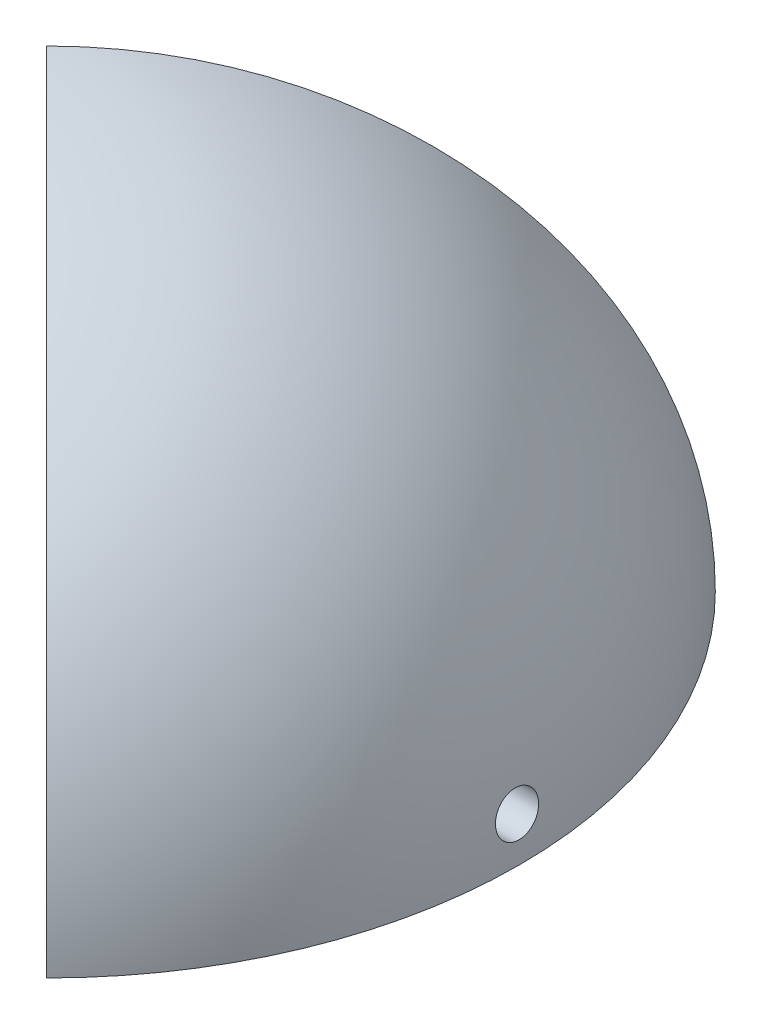
ISO-10303-21;
HEADER;
FILE_DESCRIPTION(('STEP AP214'),'2;1');
FILE_NAME('part.step','',(''),(''),'','','');
FILE_SCHEMA(('AUTOMOTIVE_DESIGN { 1 0 10303 214 1 1 1 1 }'));
ENDSEC;
DATA;
#1=APPLICATION_CONTEXT('core data for automotive mechanical design processes');
#2=APPLICATION_PROTOCOL_DEFINITION('international standard','automotive_design',2000,#1);
#3=PRODUCT_CONTEXT('',#1,'mechanical');
#4=PRODUCT('Part','Part','',(#3));
#5=PRODUCT_RELATED_PRODUCT_CATEGORY('part','',(#4));
#6=PRODUCT_DEFINITION_FORMATION('','',#4);
#7=PRODUCT_DEFINITION_CONTEXT('part definition',#1,'design');
#8=PRODUCT_DEFINITION('design','',#6,#7);
#9=PRODUCT_DEFINITION_SHAPE('','',#8);
#10=(LENGTH_UNIT() NAMED_UNIT(*) SI_UNIT(.MILLI.,.METRE.));
#11=(NAMED_UNIT(*) PLANE_ANGLE_UNIT() SI_UNIT($,.RADIAN.));
#12=(NAMED_UNIT(*) SI_UNIT($,.STERADIAN.) SOLID_ANGLE_UNIT());
#13=UNCERTAINTY_MEASURE_WITH_UNIT(LENGTH_MEASURE(1.E-05),#10,'distance_accuracy_value','');
#14=(GEOMETRIC_REPRESENTATION_CONTEXT(3) GLOBAL_UNCERTAINTY_ASSIGNED_CONTEXT((#13)) GLOBAL_UNIT_ASSIGNED_CONTEXT((#10,
#11,#12)) REPRESENTATION_CONTEXT('',''));
#15=CARTESIAN_POINT('',(0.,0.,0.));
#16=DIRECTION('',(0.,0.,1.));
#17=DIRECTION('',(1.,0.,0.));
#18=AXIS2_PLACEMENT_3D('',#15,#16,#17);
#19=CARTESIAN_POINT('',(0.,0.,0.));
#20=DIRECTION('',(0.,1.,0.));
#21=DIRECTION('',(0.707106781186546,0.,0.707106781186549));
#22=AXIS2_PLACEMENT_3D('',#19,#20,#21);
#23=SPHERICAL_SURFACE('',#22,105.);
#24=CARTESIAN_POINT('',(0.,0.,-10.));
#25=DIRECTION('',(0.,0.,1.));
#26=DIRECTION('',(1.,0.,0.));
#27=AXIS2_PLACEMENT_3D('',#24,#25,#26);
#28=CIRCLE('',#27,104.522724801834);
#29=CARTESIAN_POINT('',(102.591422643416,20.,-10.));
#30=VERTEX_POINT('',#29);
#31=CARTESIAN_POINT('',(104.522724801834,0.,-10.));
#32=VERTEX_POINT('',#31);
#33=EDGE_CURVE('E145',#30,#32,#28,.F.);
#34=ORIENTED_EDGE('',*,*,#33,.F.);
#35=CARTESIAN_POINT('',(0.,20.0000000000001,0.));
#36=DIRECTION('',(0.,1.,0.));
#37=DIRECTION('',(-1.,0.,0.));
#38=AXIS2_PLACEMENT_3D('',#35,#36,#37);
#39=CIRCLE('',#38,103.077640640441);
#40=CARTESIAN_POINT('',(102.591422643416,20.,10.));
#41=VERTEX_POINT('',#40);
#42=EDGE_CURVE('E11',#30,#41,#39,.F.);
#43=ORIENTED_EDGE('',*,*,#42,.T.);
#44=CARTESIAN_POINT('',(0.,0.,10.));
#45=DIRECTION('',(0.,0.,1.));
#46=DIRECTION('',(1.,0.,0.));
#47=AXIS2_PLACEMENT_3D('',#44,#45,#46);
#48=CIRCLE('',#47,104.522724801834);
#49=CARTESIAN_POINT('',(104.522724801834,0.,9.99999999999999));
#50=VERTEX_POINT('',#49);
#51=EDGE_CURVE('E109',#41,#50,#48,.F.);
#52=ORIENTED_EDGE('',*,*,#51,.T.);
#53=CARTESIAN_POINT('',(0.,0.,0.));
#54=DIRECTION('',(0.,1.,0.));
#55=DIRECTION('',(-1.,0.,0.));
#56=AXIS2_PLACEMENT_3D('',#53,#54,#55);
#57=CIRCLE('',#56,105.);
#58=CARTESIAN_POINT('',(74.2462120245874,0.,74.2462120245876));
#59=VERTEX_POINT('',#58);
#60=EDGE_CURVE('E53',#59,#50,#57,.T.);
#61=ORIENTED_EDGE('',*,*,#60,.F.);
#62=CARTESIAN_POINT('',(0.,0.,0.));
#63=DIRECTION('',(0.707106781186549,0.,-0.707106781186546));
#64=DIRECTION('',(0.707106781186546,0.,0.707106781186549));
#65=AXIS2_PLACEMENT_3D('',#62,#63,#64);
#66=CIRCLE('',#65,105.);
#67=CARTESIAN_POINT('',(0.,105.,0.));
#68=VERTEX_POINT('',#67);
#69=EDGE_CURVE('E167',#68,#59,#66,.T.);
#70=ORIENTED_EDGE('',*,*,#69,.F.);
#71=CARTESIAN_POINT('',(0.,0.,0.));
#72=DIRECTION('',(-0.707106781186549,0.,-0.707106781186546));
#73=DIRECTION('',(0.707106781186546,0.,-0.707106781186549));
#74=AXIS2_PLACEMENT_3D('',#71,#72,#73);
#75=CIRCLE('',#74,105.);
#76=CARTESIAN_POINT('',(74.2462120245874,0.,-74.2462120245876));
#77=VERTEX_POINT('',#76);
#78=EDGE_CURVE('E152',#68,#77,#75,.T.);
#79=ORIENTED_EDGE('',*,*,#78,.T.);
#80=EDGE_CURVE('E176',#32,#77,#57,.T.);
#81=ORIENTED_EDGE('',*,*,#80,.F.);
#82=EDGE_LOOP('',(#34,#43,#52,#61,#70,#79,#81));
#83=FACE_BOUND('',#82,.T.);
#84=ADVANCED_FACE('F45',(#83),#23,.F.);
#85=CARTESIAN_POINT('',(0.,0.,0.));
#86=DIRECTION('',(0.,1.,0.));
#87=DIRECTION('',(0.707106781186546,0.,0.707106781186549));
#88=AXIS2_PLACEMENT_3D('',#85,#86,#87);
#89=SPHERICAL_SURFACE('',#88,110.);
#90=CARTESIAN_POINT('',(109.746023045079,6.54052128911879,-3.60998712591214));
#91=CARTESIAN_POINT('',(109.755239097218,6.43937878547632,-3.51306300951663));
#92=CARTESIAN_POINT('',(109.764082984741,6.3423078868576,-3.41188039825184));
#93=CARTESIAN_POINT('',(109.780969115739,6.15694456811909,-3.20165014635052));
#94=CARTESIAN_POINT('',(109.789011156165,6.06865437151453,-3.09260052557191));
#95=CARTESIAN_POINT('',(109.804239398578,5.90145341711939,-2.86733496833067));
#96=CARTESIAN_POINT('',(109.811424865275,5.82255071774699,-2.75111300309544));
#97=CARTESIAN_POINT('',(109.824883256621,5.67475314689705,-2.51236098580688));
#98=CARTESIAN_POINT('',(109.831155848464,5.60586192531355,-2.38982865511711));
#99=CARTESIAN_POINT('',(109.842736253883,5.47866628985072,-2.13944974908984));
#100=CARTESIAN_POINT('',(109.848044728326,5.42035462409826,-2.01160688834906));
#101=CARTESIAN_POINT('',(109.857665808193,5.31466431705024,-1.75138739568702));
#102=CARTESIAN_POINT('',(109.861978045482,5.26728971727555,-1.61900910849651));
#103=CARTESIAN_POINT('',(109.869570668175,5.18387278069415,-1.35078926297139));
#104=CARTESIAN_POINT('',(109.872851685027,5.14782350902902,-1.21494987928975));
#105=CARTESIAN_POINT('',(109.878362776864,5.08727005413188,-0.940648015116576));
#106=CARTESIAN_POINT('',(109.880592464222,5.06277012915795,-0.802184586678322));
#107=CARTESIAN_POINT('',(109.883978519852,5.0255633754912,-0.524038403422183));
#108=CARTESIAN_POINT('',(109.885137681196,5.01282585792257,-0.384359786897015));
#109=CARTESIAN_POINT('',(109.886384590029,4.99912410684787,-0.104369684666429));
#110=CARTESIAN_POINT('',(109.886471942193,4.99816421739995,0.035942015458194));
#111=CARTESIAN_POINT('',(109.885573728108,5.00803433450293,0.316098633219472));
#112=CARTESIAN_POINT('',(109.884588527994,5.01886031774397,0.455943693809898));
#113=CARTESIAN_POINT('',(109.881552346453,5.0522228111282,0.734270475620808));
#114=CARTESIAN_POINT('',(109.879500971678,5.07476364328524,0.872751674438943));
#115=CARTESIAN_POINT('',(109.874350928731,5.13135073004679,1.14710088984902));
#116=CARTESIAN_POINT('',(109.871253879744,5.16537919650006,1.2829726054067));
#117=CARTESIAN_POINT('',(109.864032864805,5.24471478583503,1.55140608798298));
#118=CARTESIAN_POINT('',(109.859908520933,5.29002605941412,1.68396661709784));
#119=CARTESIAN_POINT('',(109.850663969625,5.39158234010188,1.9447491323783));
#120=CARTESIAN_POINT('',(109.845544130451,5.44782330400102,2.07297270238034));
#121=CARTESIAN_POINT('',(109.834345124902,5.57083311495385,2.32423863034515));
#122=CARTESIAN_POINT('',(109.828265604439,5.63760584784695,2.44727905460023));
#123=CARTESIAN_POINT('',(109.808632804992,5.85321665953853,2.80756128753222));
#124=CARTESIAN_POINT('',(109.793689284438,6.0173034394301,3.03585159964725));
#125=CARTESIAN_POINT('',(109.760548828044,6.38110973478549,3.46152308045846));
#126=CARTESIAN_POINT('',(109.742351843348,6.58082978532901,3.65890378492327));
#127=CARTESIAN_POINT('',(109.703141905017,7.0110520530574,4.01807623474451));
#128=CARTESIAN_POINT('',(109.682119338805,7.2416593382767,4.17974128135208));
#129=CARTESIAN_POINT('',(109.637902916295,7.72653661508685,4.46207265076378));
#130=CARTESIAN_POINT('',(109.61470901,7.98080715155593,4.58273802919762));
#131=CARTESIAN_POINT('',(109.566705039076,8.50688623475276,4.78015166539873));
#132=CARTESIAN_POINT('',(109.541888905017,8.77876060401297,4.8567230798903));
#133=CARTESIAN_POINT('',(109.491423901618,9.33143642254876,4.96308571263597));
#134=CARTESIAN_POINT('',(109.465775017649,9.61223802863894,4.99287610867738));
#135=CARTESIAN_POINT('',(109.414296283026,10.1756216567592,5.00487349162391));
#136=CARTESIAN_POINT('',(109.388466128694,10.4582064513047,4.98694941226512));
#137=CARTESIAN_POINT('',(109.337428092207,11.0163734832293,4.90373378035013));
#138=CARTESIAN_POINT('',(109.312220213832,11.2919556780561,4.83844194002759));
#139=CARTESIAN_POINT('',(109.263137833715,11.8283656816175,4.66227353928807));
#140=CARTESIAN_POINT('',(109.23926373785,12.0891889994668,4.55138318794024));
#141=CARTESIAN_POINT('',(109.193543055156,12.588533916754,4.28710697266462));
#142=CARTESIAN_POINT('',(109.171696449832,12.8270557196394,4.13372149645275));
#143=CARTESIAN_POINT('',(109.130710974234,13.2744171017605,3.78915865105044));
#144=CARTESIAN_POINT('',(109.111565984533,13.483323767326,3.59806912101587));
#145=CARTESIAN_POINT('',(109.076481951632,13.8660696809526,3.18325935816811));
#146=CARTESIAN_POINT('',(109.060542843352,14.039909640876,2.95953978791135));
#147=CARTESIAN_POINT('',(109.032394368721,14.3468588143189,2.48675400542475));
#148=CARTESIAN_POINT('',(109.020170664155,14.480124612111,2.23779030830782));
#149=CARTESIAN_POINT('',(108.999728989861,14.7029592624478,1.72086736229766));
#150=CARTESIAN_POINT('',(108.991510929596,14.7925291026233,1.45290854289534));
#151=CARTESIAN_POINT('',(108.979346984613,14.925098400909,0.906692443606996));
#152=CARTESIAN_POINT('',(108.975385047691,14.9682728420285,0.628477981509955));
#153=CARTESIAN_POINT('',(108.971795155376,15.0073931995078,0.0687214360673181));
#154=CARTESIAN_POINT('',(108.972167138926,15.0033397812195,-0.212820600343174));
#155=CARTESIAN_POINT('',(108.977228660077,14.948181990041,-0.770650147639461));
#156=CARTESIAN_POINT('',(108.981909665276,14.8971705998201,-1.04694694165116));
#157=CARTESIAN_POINT('',(108.995440323318,14.7497017020414,-1.58703384636253));
#158=CARTESIAN_POINT('',(109.004289970706,14.653244253961,-1.85082397342978));
#159=CARTESIAN_POINT('',(109.025902868825,14.4176310049472,-2.35859666919931));
#160=CARTESIAN_POINT('',(109.038668868008,14.2784452176916,-2.60256517473726));
#161=CARTESIAN_POINT('',(109.06775428392,13.9612592821944,-3.06376253825981));
#162=CARTESIAN_POINT('',(109.084073755853,13.7832585309533,-3.28099098074927));
#163=CARTESIAN_POINT('',(109.110864346503,13.4909680954996,-3.58230514501654));
#164=CARTESIAN_POINT('',(109.120201325382,13.389087835343,-3.67882781336989));
#165=CARTESIAN_POINT('',(109.139578066886,13.177629655679,-3.86293732603117));
#166=CARTESIAN_POINT('',(109.149617573329,13.0680545421296,-3.95052739936573));
#167=CARTESIAN_POINT('',(109.170331830031,12.8419377732258,-4.11619379598081));
#168=CARTESIAN_POINT('',(109.181006822241,12.7253934643959,-4.19426646074875));
#169=CARTESIAN_POINT('',(109.202908921127,12.4862401505006,-4.34030295247132));
#170=CARTESIAN_POINT('',(109.214135826012,12.3636333619022,-4.40827043803398));
#171=CARTESIAN_POINT('',(109.237116491359,12.1126256624672,-4.53393877135669));
#172=CARTESIAN_POINT('',(109.248872376721,11.9842013658231,-4.59159251755541));
#173=CARTESIAN_POINT('',(109.272775827128,11.7230302910739,-4.69584165151599));
#174=CARTESIAN_POINT('',(109.284923248409,11.5902850993473,-4.7424410468515));
#175=CARTESIAN_POINT('',(109.309531702853,11.3213215188688,-4.82430066091483));
#176=CARTESIAN_POINT('',(109.32199284234,11.185101952375,-4.85955697792131));
#177=CARTESIAN_POINT('',(109.347131728829,10.9102470296428,-4.91845471393709));
#178=CARTESIAN_POINT('',(109.359809395015,10.7716125743452,-4.94210037243139));
#179=CARTESIAN_POINT('',(109.38534161876,10.4923601247187,-4.97769666506907));
#180=CARTESIAN_POINT('',(109.398196645427,10.3517368254489,-4.98960535882537));
#181=CARTESIAN_POINT('',(109.423943070412,10.070042429159,-5.0014957948491));
#182=CARTESIAN_POINT('',(109.436834453704,9.9289715147863,-5.00148189896848));
#183=CARTESIAN_POINT('',(109.462574986199,9.64724215706145,-4.98953432340346));
#184=CARTESIAN_POINT('',(109.475424103956,9.50658402676329,-4.9775931907473));
#185=CARTESIAN_POINT('',(109.500976126553,9.22681952549234,-4.94186916570966));
#186=CARTESIAN_POINT('',(109.513679083581,9.08771260124271,-4.91809064317045));
#187=CARTESIAN_POINT('',(109.538877917563,8.81171918028698,-4.85880115495311));
#188=CARTESIAN_POINT('',(109.55137334782,8.67483748410621,-4.82326764714799));
#189=CARTESIAN_POINT('',(109.576038376114,8.40459829518795,-4.74074326014926));
#190=CARTESIAN_POINT('',(109.588208091916,8.27123952893735,-4.69375658579028));
#191=CARTESIAN_POINT('',(109.612129368268,8.00906192390052,-4.58869151465808));
#192=CARTESIAN_POINT('',(109.623881290239,7.88023916211437,-4.53062299582481));
#193=CARTESIAN_POINT('',(109.646890713814,7.62797445660143,-4.40379668894558));
#194=CARTESIAN_POINT('',(109.658148344295,7.50453111034981,-4.33504170868899));
#195=CARTESIAN_POINT('',(109.682943805371,7.23260145613031,-4.16810856001615));
#196=CARTESIAN_POINT('',(109.696314969647,7.08593234480932,-4.06692555580504));
#197=CARTESIAN_POINT('',(109.721998773484,6.80415751108473,-3.84944975306916));
#198=CARTESIAN_POINT('',(109.73431141315,6.6690517875511,-3.73315695602099));
#199=CARTESIAN_POINT('',(109.746023045079,6.54052128911879,-3.60998712591214));
#200=B_SPLINE_CURVE_WITH_KNOTS('',3,(#90,#91,#92,#93,#94,#95,#96,#97,#98,#99,#100,#101,#102,
#103,#104,#105,#106,#107,#108,#109,#110,#111,#112,#113,#114,#115,#116,#117,#118,#119,#120,#121,
#122,#123,#124,#125,#126,#127,#128,#129,#130,#131,#132,#133,#134,#135,#136,#137,#138,#139,#140,
#141,#142,#143,#144,#145,#146,#147,#148,#149,#150,#151,#152,#153,#154,#155,#156,#157,#158,#159,
#160,#161,#162,#163,#164,#165,#166,#167,#168,#169,#170,#171,#172,#173,#174,#175,#176,#177,#178,
#179,#180,#181,#182,#183,#184,#185,#186,#187,#188,#189,#190,#191,#192,#193,#194,#195,#196,#197,
#198,#199),.UNSPECIFIED.,.T.,.F.,(4,2,2,2,2,2,2,2,2,2,2,2,2,2,2,2,2,2,2,2,2,2,2,2,2,2,2,2,2,2,2,
2,2,2,2,2,2,2,2,2,2,2,2,2,2,2,2,2,2,2,2,2,2,2,4),(0.,0.421011785743711,0.842129913234622,
1.2636069679742,1.68523729758613,2.10657751504284,2.52807317997916,2.9493102443874,
3.37070249817061,3.79099218029036,4.21143687731936,4.63173809332918,5.05219448321926,
5.47200277661704,5.89196573703931,6.31177363569553,6.73173679209513,7.57202093292874,
8.41231769277888,9.25554911511827,10.0987999588035,10.9454096042629,11.7920341293771,
12.6409866343155,13.4899442968128,14.3391589093174,15.1883657740351,16.0356171160941,
16.8828512570188,17.726773040901,18.5706757492974,19.4113843353912,20.2520810774922,
21.0911167072111,21.9301512388464,22.7697759478672,23.6094137015828,24.0309662904859,
24.4523659489371,24.8739270869299,25.2953352239171,25.718621305377,26.1417536960841,
26.5650314780089,26.9881545902662,27.412784249951,27.8372585599196,28.2619982771646,
28.6865813153806,29.1119833277744,29.5372293956912,29.9620981708557,30.3868555029854,
30.9218715250025,31.4568874947357),.UNSPECIFIED.);
#201=CARTESIAN_POINT('',(109.746023045079,6.54052128911879,-3.60998712591214));
#202=VERTEX_POINT('',#201);
#203=EDGE_CURVE('E112',#202,#202,#200,.T.);
#204=ORIENTED_EDGE('',*,*,#203,.T.);
#205=EDGE_LOOP('',(#204));
#206=FACE_BOUND('',#205,.T.);
#207=CARTESIAN_POINT('',(0.,0.,0.));
#208=DIRECTION('',(0.707106781186549,0.,0.707106781186546));
#209=DIRECTION('',(0.707106781186546,0.,-0.707106781186549));
#210=AXIS2_PLACEMENT_3D('',#207,#208,#209);
#211=CIRCLE('',#210,110.);
#212=CARTESIAN_POINT('',(77.7817459305201,0.,-77.7817459305204));
#213=VERTEX_POINT('',#212);
#214=CARTESIAN_POINT('',(0.,110.,0.));
#215=VERTEX_POINT('',#214);
#216=EDGE_CURVE('E148',#213,#215,#211,.T.);
#217=ORIENTED_EDGE('',*,*,#216,.T.);
#218=CARTESIAN_POINT('',(0.,0.,0.));
#219=DIRECTION('',(-0.707106781186549,0.,0.707106781186546));
#220=DIRECTION('',(0.707106781186546,0.,0.707106781186549));
#221=AXIS2_PLACEMENT_3D('',#218,#219,#220);
#222=CIRCLE('',#221,110.);
#223=CARTESIAN_POINT('',(77.7817459305201,0.,77.7817459305204));
#224=VERTEX_POINT('',#223);
#225=EDGE_CURVE('E159',#224,#215,#222,.T.);
#226=ORIENTED_EDGE('',*,*,#225,.F.);
#227=CARTESIAN_POINT('',(0.,0.,0.));
#228=DIRECTION('',(0.,1.,0.));
#229=DIRECTION('',(-1.,0.,0.));
#230=AXIS2_PLACEMENT_3D('',#227,#228,#229);
#231=CIRCLE('',#230,110.);
#232=EDGE_CURVE('E68',#224,#213,#231,.T.);
#233=ORIENTED_EDGE('',*,*,#232,.T.);
#234=EDGE_LOOP('',(#217,#226,#233));
#235=FACE_BOUND('',#234,.T.);
#236=ADVANCED_FACE('F191',(#206,#235),#89,.T.);
#237=CARTESIAN_POINT('',(74.2462120245874,0.,74.2462120245876));
#238=DIRECTION('',(0.,1.,0.));
#239=DIRECTION('',(-1.,0.,0.));
#240=AXIS2_PLACEMENT_3D('',#237,#238,#239);
#241=PLANE('',#240);
#242=DIRECTION('',(1.,0.,0.));
#243=VECTOR('',#242,1.);
#244=CARTESIAN_POINT('',(105.,0.,-10.));
#245=LINE('',#244,#243);
#246=CARTESIAN_POINT('',(95.,0.,-10.));
#247=VERTEX_POINT('',#246);
#248=EDGE_CURVE('E124',#247,#32,#245,.T.);
#249=ORIENTED_EDGE('',*,*,#248,.T.);
#250=ORIENTED_EDGE('',*,*,#80,.T.);
#251=DIRECTION('',(0.707106781186546,0.,-0.707106781186549));
#252=VECTOR('',#251,1.);
#253=CARTESIAN_POINT('',(74.2462120245874,0.,-74.2462120245876));
#254=LINE('',#253,#252);
#255=EDGE_CURVE('E156',#77,#213,#254,.T.);
#256=ORIENTED_EDGE('',*,*,#255,.T.);
#257=ORIENTED_EDGE('',*,*,#232,.F.);
#258=DIRECTION('',(0.707106781186546,0.,0.707106781186549));
#259=VECTOR('',#258,1.);
#260=CARTESIAN_POINT('',(74.2462120245874,0.,74.2462120245876));
#261=LINE('',#260,#259);
#262=EDGE_CURVE('E171',#59,#224,#261,.T.);
#263=ORIENTED_EDGE('',*,*,#262,.F.);
#264=ORIENTED_EDGE('',*,*,#60,.T.);
#265=DIRECTION('',(1.,0.,0.));
#266=VECTOR('',#265,1.);
#267=CARTESIAN_POINT('',(105.,0.,10.));
#268=LINE('',#267,#266);
#269=CARTESIAN_POINT('',(95.,0.,10.));
#270=VERTEX_POINT('',#269);
#271=EDGE_CURVE('E60',#270,#50,#268,.T.);
#272=ORIENTED_EDGE('',*,*,#271,.F.);
#273=DIRECTION('',(0.,0.,1.));
#274=VECTOR('',#273,1.);
#275=CARTESIAN_POINT('',(95.,0.,-10.));
#276=LINE('',#275,#274);
#277=EDGE_CURVE('E123',#247,#270,#276,.T.);
#278=ORIENTED_EDGE('',*,*,#277,.F.);
#279=EDGE_LOOP('',(#249,#250,#256,#257,#263,#264,#272,#278));
#280=FACE_BOUND('',#279,.T.);
#281=ADVANCED_FACE('F181',(#280),#241,.F.);
#282=CARTESIAN_POINT('',(0.,0.,0.));
#283=DIRECTION('',(-0.707106781186549,0.,0.707106781186546));
#284=DIRECTION('',(0.707106781186546,0.,0.707106781186549));
#285=AXIS2_PLACEMENT_3D('',#282,#283,#284);
#286=PLANE('',#285);
#287=ORIENTED_EDGE('',*,*,#225,.T.);
#288=DIRECTION('',(0.,-1.,0.));
#289=VECTOR('',#288,1.);
#290=CARTESIAN_POINT('',(0.,105.,0.));
#291=LINE('',#290,#289);
#292=EDGE_CURVE('E163',#215,#68,#291,.T.);
#293=ORIENTED_EDGE('',*,*,#292,.T.);
#294=ORIENTED_EDGE('',*,*,#69,.T.);
#295=ORIENTED_EDGE('',*,*,#262,.T.);
#296=EDGE_LOOP('',(#287,#293,#294,#295));
#297=FACE_BOUND('',#296,.T.);
#298=ADVANCED_FACE('F193',(#297),#286,.T.);
#299=CARTESIAN_POINT('',(0.,0.,0.));
#300=DIRECTION('',(0.707106781186549,0.,0.707106781186546));
#301=DIRECTION('',(0.707106781186546,0.,-0.707106781186549));
#302=AXIS2_PLACEMENT_3D('',#299,#300,#301);
#303=PLANE('',#302);
#304=ORIENTED_EDGE('',*,*,#216,.F.);
#305=ORIENTED_EDGE('',*,*,#255,.F.);
#306=ORIENTED_EDGE('',*,*,#78,.F.);
#307=ORIENTED_EDGE('',*,*,#292,.F.);
#308=EDGE_LOOP('',(#304,#305,#306,#307));
#309=FACE_BOUND('',#308,.T.);
#310=ADVANCED_FACE('F189',(#309),#303,.F.);
#311=CARTESIAN_POINT('',(105.,20.,-10.));
#312=DIRECTION('',(0.,1.,0.));
#313=DIRECTION('',(-1.,0.,0.));
#314=AXIS2_PLACEMENT_3D('',#311,#312,#313);
#315=PLANE('',#314);
#316=ORIENTED_EDGE('',*,*,#42,.F.);
#317=DIRECTION('',(-1.,0.,0.));
#318=VECTOR('',#317,1.);
#319=CARTESIAN_POINT('',(105.,20.,-10.));
#320=LINE('',#319,#318);
#321=CARTESIAN_POINT('',(95.,20.,-10.));
#322=VERTEX_POINT('',#321);
#323=EDGE_CURVE('E118',#30,#322,#320,.T.);
#324=ORIENTED_EDGE('',*,*,#323,.T.);
#325=DIRECTION('',(0.,0.,1.));
#326=VECTOR('',#325,1.);
#327=CARTESIAN_POINT('',(95.,20.,-10.));
#328=LINE('',#327,#326);
#329=CARTESIAN_POINT('',(95.,20.,10.));
#330=VERTEX_POINT('',#329);
#331=EDGE_CURVE('E115',#322,#330,#328,.T.);
#332=ORIENTED_EDGE('',*,*,#331,.T.);
#333=DIRECTION('',(-1.,0.,0.));
#334=VECTOR('',#333,1.);
#335=CARTESIAN_POINT('',(105.,20.,10.));
#336=LINE('',#335,#334);
#337=EDGE_CURVE('E104',#41,#330,#336,.T.);
#338=ORIENTED_EDGE('',*,*,#337,.F.);
#339=EDGE_LOOP('',(#316,#324,#332,#338));
#340=FACE_BOUND('',#339,.T.);
#341=ADVANCED_FACE('F116',(#340),#315,.T.);
#342=CARTESIAN_POINT('',(0.,0.,-10.));
#343=DIRECTION('',(0.,0.,1.));
#344=DIRECTION('',(1.,0.,0.));
#345=AXIS2_PLACEMENT_3D('',#342,#343,#344);
#346=PLANE('',#345);
#347=ORIENTED_EDGE('',*,*,#323,.F.);
#348=ORIENTED_EDGE('',*,*,#33,.T.);
#349=ORIENTED_EDGE('',*,*,#248,.F.);
#350=DIRECTION('',(0.,-1.,0.));
#351=VECTOR('',#350,1.);
#352=CARTESIAN_POINT('',(95.,0.,-10.));
#353=LINE('',#352,#351);
#354=EDGE_CURVE('E135',#322,#247,#353,.T.);
#355=ORIENTED_EDGE('',*,*,#354,.F.);
#356=EDGE_LOOP('',(#347,#348,#349,#355));
#357=FACE_BOUND('',#356,.T.);
#358=ADVANCED_FACE('F226',(#357),#346,.F.);
#359=CARTESIAN_POINT('',(0.,0.,10.));
#360=DIRECTION('',(0.,0.,1.));
#361=DIRECTION('',(1.,0.,0.));
#362=AXIS2_PLACEMENT_3D('',#359,#360,#361);
#363=PLANE('',#362);
#364=ORIENTED_EDGE('',*,*,#51,.F.);
#365=ORIENTED_EDGE('',*,*,#337,.T.);
#366=DIRECTION('',(0.,-1.,0.));
#367=VECTOR('',#366,1.);
#368=CARTESIAN_POINT('',(95.,0.,10.));
#369=LINE('',#368,#367);
#370=EDGE_CURVE('E108',#330,#270,#369,.T.);
#371=ORIENTED_EDGE('',*,*,#370,.T.);
#372=ORIENTED_EDGE('',*,*,#271,.T.);
#373=EDGE_LOOP('',(#364,#365,#371,#372));
#374=FACE_BOUND('',#373,.T.);
#375=ADVANCED_FACE('F106',(#374),#363,.T.);
#376=CARTESIAN_POINT('',(95.,0.,-10.));
#377=DIRECTION('',(-1.,0.,0.));
#378=DIRECTION('',(0.,0.,1.));
#379=AXIS2_PLACEMENT_3D('',#376,#377,#378);
#380=PLANE('',#379);
#381=CARTESIAN_POINT('',(95.,10.,0.));
#382=DIRECTION('',(-1.,0.,0.));
#383=DIRECTION('',(0.,0.,1.));
#384=AXIS2_PLACEMENT_3D('',#381,#382,#383);
#385=CIRCLE('',#384,5.);
#386=CARTESIAN_POINT('',(95.,10.,5.));
#387=VERTEX_POINT('',#386);
#388=EDGE_CURVE('E219',#387,#387,#385,.T.);
#389=ORIENTED_EDGE('',*,*,#388,.F.);
#390=EDGE_LOOP('',(#389));
#391=FACE_BOUND('',#390,.T.);
#392=ORIENTED_EDGE('',*,*,#277,.T.);
#393=ORIENTED_EDGE('',*,*,#370,.F.);
#394=ORIENTED_EDGE('',*,*,#331,.F.);
#395=ORIENTED_EDGE('',*,*,#354,.T.);
#396=EDGE_LOOP('',(#392,#393,#394,#395));
#397=FACE_BOUND('',#396,.T.);
#398=ADVANCED_FACE('F126',(#391,#397),#380,.T.);
#399=CARTESIAN_POINT('',(110.,10.,0.));
#400=DIRECTION('',(-1.,0.,0.));
#401=DIRECTION('',(0.,0.,1.));
#402=AXIS2_PLACEMENT_3D('',#399,#400,#401);
#403=CYLINDRICAL_SURFACE('',#402,5.);
#404=ORIENTED_EDGE('',*,*,#388,.T.);
#405=EDGE_LOOP('',(#404));
#406=FACE_BOUND('',#405,.T.);
#407=ORIENTED_EDGE('',*,*,#203,.F.);
#408=EDGE_LOOP('',(#407));
#409=FACE_BOUND('',#408,.T.);
#410=ADVANCED_FACE('F220',(#406,#409),#403,.F.);
#411=CLOSED_SHELL('',(#84,#236,#281,#298,#310,#341,#358,#375,#398,#410));
#412=MANIFOLD_SOLID_BREP('B2',#411);
#413=ADVANCED_BREP_SHAPE_REPRESENTATION('',(#18,#412),#14);
#414=SHAPE_DEFINITION_REPRESENTATION(#9,#413);
ENDSEC;
END-ISO-10303-21;
